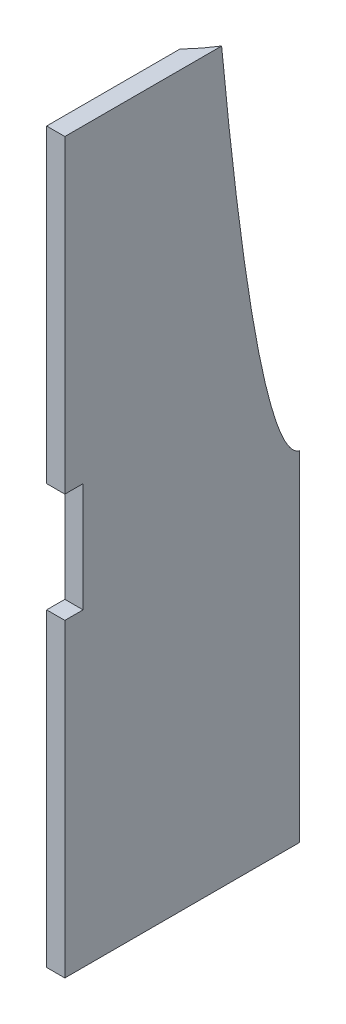
ISO-10303-21;
HEADER;
FILE_DESCRIPTION(('STEP AP214'),'2;1');
FILE_NAME('part.step','',(''),(''),'','','');
FILE_SCHEMA(('AUTOMOTIVE_DESIGN { 1 0 10303 214 1 1 1 1 }'));
ENDSEC;
DATA;
#1=APPLICATION_CONTEXT('core data for automotive mechanical design processes');
#2=APPLICATION_PROTOCOL_DEFINITION('international standard','automotive_design',2000,#1);
#3=PRODUCT_CONTEXT('',#1,'mechanical');
#4=PRODUCT('Part','Part','',(#3));
#5=PRODUCT_RELATED_PRODUCT_CATEGORY('part','',(#4));
#6=PRODUCT_DEFINITION_FORMATION('','',#4);
#7=PRODUCT_DEFINITION_CONTEXT('part definition',#1,'design');
#8=PRODUCT_DEFINITION('design','',#6,#7);
#9=PRODUCT_DEFINITION_SHAPE('','',#8);
#10=(LENGTH_UNIT() NAMED_UNIT(*) SI_UNIT(.MILLI.,.METRE.));
#11=(NAMED_UNIT(*) PLANE_ANGLE_UNIT() SI_UNIT($,.RADIAN.));
#12=(NAMED_UNIT(*) SI_UNIT($,.STERADIAN.) SOLID_ANGLE_UNIT());
#13=UNCERTAINTY_MEASURE_WITH_UNIT(LENGTH_MEASURE(1.E-05),#10,'distance_accuracy_value','');
#14=(GEOMETRIC_REPRESENTATION_CONTEXT(3) GLOBAL_UNCERTAINTY_ASSIGNED_CONTEXT((#13)) GLOBAL_UNIT_ASSIGNED_CONTEXT((#10,
#11,#12)) REPRESENTATION_CONTEXT('',''));
#15=CARTESIAN_POINT('',(0.,0.,0.));
#16=DIRECTION('',(0.,0.,1.));
#17=DIRECTION('',(1.,0.,0.));
#18=AXIS2_PLACEMENT_3D('',#15,#16,#17);
#19=CARTESIAN_POINT('',(0.,31.75,-7.73683999999999));
#20=DIRECTION('',(0.,0.,1.));
#21=DIRECTION('',(0.,-1.,0.));
#22=AXIS2_PLACEMENT_3D('',#19,#20,#21);
#23=PLANE('',#22);
#24=DIRECTION('',(-0.0593557164353479,-0.998236895193945,0.));
#25=VECTOR('',#24,1.);
#26=CARTESIAN_POINT('',(35.4305579406272,566.99568911841,-7.73683999999993));
#27=LINE('',#26,#25);
#28=CARTESIAN_POINT('',(1.58749999999875,-2.17255804310556,-7.73683999999997));
#29=VERTEX_POINT('',#28);
#30=CARTESIAN_POINT('',(0.,-28.8709312797254,-7.73683999999993));
#31=VERTEX_POINT('',#30);
#32=EDGE_CURVE('E12',#29,#31,#27,.T.);
#33=ORIENTED_EDGE('',*,*,#32,.F.);
#34=DIRECTION('',(0.,-1.,0.));
#35=VECTOR('',#34,1.);
#36=CARTESIAN_POINT('',(1.5875,31.75,-7.73683999999999));
#37=LINE('',#36,#35);
#38=CARTESIAN_POINT('',(1.5875,-31.75,-7.73684));
#39=VERTEX_POINT('',#38);
#40=EDGE_CURVE('E142',#29,#39,#37,.T.);
#41=ORIENTED_EDGE('',*,*,#40,.T.);
#42=DIRECTION('',(1.,0.,0.));
#43=VECTOR('',#42,1.);
#44=CARTESIAN_POINT('',(0.,-31.75,-7.73684));
#45=LINE('',#44,#43);
#46=CARTESIAN_POINT('',(0.,-31.75,-7.73684));
#47=VERTEX_POINT('',#46);
#48=EDGE_CURVE('E245',#47,#39,#45,.T.);
#49=ORIENTED_EDGE('',*,*,#48,.F.);
#50=DIRECTION('',(0.,-1.,0.));
#51=VECTOR('',#50,1.);
#52=CARTESIAN_POINT('',(0.,31.75,-7.73683999999999));
#53=LINE('',#52,#51);
#54=EDGE_CURVE('E215',#31,#47,#53,.T.);
#55=ORIENTED_EDGE('',*,*,#54,.F.);
#56=EDGE_LOOP('',(#33,#41,#49,#55));
#57=FACE_BOUND('',#56,.T.);
#58=ADVANCED_FACE('F138',(#57),#23,.F.);
#59=CARTESIAN_POINT('',(1.5875,-31.75,12.7));
#60=DIRECTION('',(0.,0.,-1.));
#61=DIRECTION('',(-1.,0.,0.));
#62=AXIS2_PLACEMENT_3D('',#59,#60,#61);
#63=PLANE('',#62);
#64=DIRECTION('',(1.,0.,0.));
#65=VECTOR('',#64,1.);
#66=CARTESIAN_POINT('',(-1.5875,4.7625,12.7));
#67=LINE('',#66,#65);
#68=CARTESIAN_POINT('',(0.,4.7625,12.7));
#69=VERTEX_POINT('',#68);
#70=CARTESIAN_POINT('',(1.5875,4.7625,12.7));
#71=VERTEX_POINT('',#70);
#72=EDGE_CURVE('E219',#69,#71,#67,.T.);
#73=ORIENTED_EDGE('',*,*,#72,.T.);
#74=DIRECTION('',(0.,-1.,0.));
#75=VECTOR('',#74,1.);
#76=CARTESIAN_POINT('',(1.5875,-31.75,12.7));
#77=LINE('',#76,#75);
#78=CARTESIAN_POINT('',(1.5875,31.75,12.7));
#79=VERTEX_POINT('',#78);
#80=EDGE_CURVE('E244',#79,#71,#77,.T.);
#81=ORIENTED_EDGE('',*,*,#80,.F.);
#82=DIRECTION('',(-1.,0.,0.));
#83=VECTOR('',#82,1.);
#84=CARTESIAN_POINT('',(1.5875,31.75,12.7));
#85=LINE('',#84,#83);
#86=CARTESIAN_POINT('',(0.,31.75,12.7));
#87=VERTEX_POINT('',#86);
#88=EDGE_CURVE('E221',#79,#87,#85,.T.);
#89=ORIENTED_EDGE('',*,*,#88,.T.);
#90=DIRECTION('',(0.,-1.,0.));
#91=VECTOR('',#90,1.);
#92=CARTESIAN_POINT('',(0.,-31.75,12.7));
#93=LINE('',#92,#91);
#94=EDGE_CURVE('E228',#87,#69,#93,.T.);
#95=ORIENTED_EDGE('',*,*,#94,.T.);
#96=EDGE_LOOP('',(#73,#81,#89,#95));
#97=FACE_BOUND('',#96,.T.);
#98=ADVANCED_FACE('F291',(#97),#63,.F.);
#99=CARTESIAN_POINT('',(1.5875,0.,0.));
#100=DIRECTION('',(-1.,0.,0.));
#101=DIRECTION('',(0.,0.,1.));
#102=AXIS2_PLACEMENT_3D('',#99,#100,#101);
#103=PLANE('',#102);
#104=CARTESIAN_POINT('',(1.5875,218.184665358992,-7.93749999999926));
#105=DIRECTION('',(-1.,0.,0.));
#106=DIRECTION('',(0.,-1.,0.));
#107=AXIS2_PLACEMENT_3D('',#104,#105,#106);
#108=ELLIPSE('',#107,220.383154068206,13.081);
#109=CARTESIAN_POINT('',(1.5875,31.75,-0.962041521268374));
#110=VERTEX_POINT('',#109);
#111=EDGE_CURVE('E148',#110,#29,#108,.F.);
#112=ORIENTED_EDGE('',*,*,#111,.F.);
#113=DIRECTION('',(0.,0.,1.));
#114=VECTOR('',#113,1.);
#115=CARTESIAN_POINT('',(1.5875,31.75,12.7));
#116=LINE('',#115,#114);
#117=EDGE_CURVE('E251',#110,#79,#116,.T.);
#118=ORIENTED_EDGE('',*,*,#117,.T.);
#119=ORIENTED_EDGE('',*,*,#80,.T.);
#120=DIRECTION('',(0.,0.,-1.));
#121=VECTOR('',#120,1.);
#122=CARTESIAN_POINT('',(1.5875,4.7625,12.7));
#123=LINE('',#122,#121);
#124=CARTESIAN_POINT('',(1.5875,4.7625,11.1125));
#125=VERTEX_POINT('',#124);
#126=EDGE_CURVE('E241',#71,#125,#123,.T.);
#127=ORIENTED_EDGE('',*,*,#126,.T.);
#128=DIRECTION('',(0.,-1.,0.));
#129=VECTOR('',#128,1.);
#130=CARTESIAN_POINT('',(1.5875,4.7625,11.1125));
#131=LINE('',#130,#129);
#132=CARTESIAN_POINT('',(1.5875,-4.7625,11.1125));
#133=VERTEX_POINT('',#132);
#134=EDGE_CURVE('E237',#125,#133,#131,.T.);
#135=ORIENTED_EDGE('',*,*,#134,.T.);
#136=DIRECTION('',(0.,0.,-1.));
#137=VECTOR('',#136,1.);
#138=CARTESIAN_POINT('',(1.5875,-4.7625,12.7));
#139=LINE('',#138,#137);
#140=CARTESIAN_POINT('',(1.5875,-4.7625,12.7));
#141=VERTEX_POINT('',#140);
#142=EDGE_CURVE('E234',#141,#133,#139,.T.);
#143=ORIENTED_EDGE('',*,*,#142,.F.);
#144=CARTESIAN_POINT('',(1.5875,-31.75,12.7));
#145=VERTEX_POINT('',#144);
#146=EDGE_CURVE('E240',#141,#145,#77,.T.);
#147=ORIENTED_EDGE('',*,*,#146,.T.);
#148=DIRECTION('',(0.,0.,-1.));
#149=VECTOR('',#148,1.);
#150=CARTESIAN_POINT('',(1.5875,-31.75,12.7));
#151=LINE('',#150,#149);
#152=EDGE_CURVE('E218',#145,#39,#151,.T.);
#153=ORIENTED_EDGE('',*,*,#152,.T.);
#154=ORIENTED_EDGE('',*,*,#40,.F.);
#155=EDGE_LOOP('',(#112,#118,#119,#127,#135,#143,#147,#153,#154));
#156=FACE_BOUND('',#155,.T.);
#157=ADVANCED_FACE('F140',(#156),#103,.F.);
#158=CARTESIAN_POINT('',(0.,0.,0.));
#159=DIRECTION('',(-1.,0.,0.));
#160=DIRECTION('',(0.,0.,1.));
#161=AXIS2_PLACEMENT_3D('',#158,#159,#160);
#162=PLANE('',#161);
#163=DIRECTION('',(0.,0.,1.));
#164=VECTOR('',#163,1.);
#165=CARTESIAN_POINT('',(0.,31.75,12.7));
#166=LINE('',#165,#164);
#167=CARTESIAN_POINT('',(0.,31.75,1.07461577579389));
#168=VERTEX_POINT('',#167);
#169=EDGE_CURVE('E253',#168,#87,#166,.T.);
#170=ORIENTED_EDGE('',*,*,#169,.F.);
#171=CARTESIAN_POINT('',(0.,191.48629212233,-7.93749999999926));
#172=DIRECTION('',(-1.,0.,0.));
#173=DIRECTION('',(0.,-1.,0.));
#174=AXIS2_PLACEMENT_3D('',#171,#172,#173);
#175=ELLIPSE('',#174,220.383154068206,13.081);
#176=EDGE_CURVE('E154',#168,#31,#175,.F.);
#177=ORIENTED_EDGE('',*,*,#176,.T.);
#178=ORIENTED_EDGE('',*,*,#54,.T.);
#179=DIRECTION('',(0.,0.,-1.));
#180=VECTOR('',#179,1.);
#181=CARTESIAN_POINT('',(0.,-31.75,12.7));
#182=LINE('',#181,#180);
#183=CARTESIAN_POINT('',(0.,-31.75,12.7));
#184=VERTEX_POINT('',#183);
#185=EDGE_CURVE('E248',#184,#47,#182,.T.);
#186=ORIENTED_EDGE('',*,*,#185,.F.);
#187=CARTESIAN_POINT('',(0.,-4.7625,12.7));
#188=VERTEX_POINT('',#187);
#189=EDGE_CURVE('E254',#188,#184,#93,.T.);
#190=ORIENTED_EDGE('',*,*,#189,.F.);
#191=DIRECTION('',(0.,0.,1.));
#192=VECTOR('',#191,1.);
#193=CARTESIAN_POINT('',(0.,-4.76249999999999,0.));
#194=LINE('',#193,#192);
#195=CARTESIAN_POINT('',(0.,-4.7625,11.1125));
#196=VERTEX_POINT('',#195);
#197=EDGE_CURVE('E266',#196,#188,#194,.T.);
#198=ORIENTED_EDGE('',*,*,#197,.F.);
#199=DIRECTION('',(0.,1.,0.));
#200=VECTOR('',#199,1.);
#201=CARTESIAN_POINT('',(0.,0.,11.1125));
#202=LINE('',#201,#200);
#203=CARTESIAN_POINT('',(0.,4.7625,11.1125));
#204=VERTEX_POINT('',#203);
#205=EDGE_CURVE('E256',#196,#204,#202,.T.);
#206=ORIENTED_EDGE('',*,*,#205,.T.);
#207=DIRECTION('',(0.,0.,1.));
#208=VECTOR('',#207,1.);
#209=CARTESIAN_POINT('',(0.,4.7625,0.));
#210=LINE('',#209,#208);
#211=EDGE_CURVE('E255',#204,#69,#210,.T.);
#212=ORIENTED_EDGE('',*,*,#211,.T.);
#213=ORIENTED_EDGE('',*,*,#94,.F.);
#214=EDGE_LOOP('',(#170,#177,#178,#186,#190,#198,#206,#212,#213));
#215=FACE_BOUND('',#214,.T.);
#216=ADVANCED_FACE('F290',(#215),#162,.T.);
#217=CARTESIAN_POINT('',(1.5875,31.75,12.7));
#218=DIRECTION('',(0.,-1.,0.));
#219=DIRECTION('',(0.,0.,-1.));
#220=AXIS2_PLACEMENT_3D('',#217,#218,#219);
#221=PLANE('',#220);
#222=CARTESIAN_POINT('',(-9.49800804327598,31.7500000000001,-7.93749999999926));
#223=DIRECTION('',(0.,-1.,0.));
#224=DIRECTION('',(-1.,0.,0.));
#225=AXIS2_PLACEMENT_3D('',#222,#223,#224);
#226=ELLIPSE('',#225,13.1041039085803,13.081);
#227=EDGE_CURVE('E206',#168,#110,#226,.F.);
#228=ORIENTED_EDGE('',*,*,#227,.F.);
#229=ORIENTED_EDGE('',*,*,#169,.T.);
#230=ORIENTED_EDGE('',*,*,#88,.F.);
#231=ORIENTED_EDGE('',*,*,#117,.F.);
#232=EDGE_LOOP('',(#228,#229,#230,#231));
#233=FACE_BOUND('',#232,.T.);
#234=ADVANCED_FACE('F294',(#233),#221,.F.);
#235=ORIENTED_EDGE('',*,*,#146,.F.);
#236=DIRECTION('',(1.,0.,0.));
#237=VECTOR('',#236,1.);
#238=CARTESIAN_POINT('',(-1.5875,-4.7625,12.7));
#239=LINE('',#238,#237);
#240=EDGE_CURVE('E232',#188,#141,#239,.T.);
#241=ORIENTED_EDGE('',*,*,#240,.F.);
#242=ORIENTED_EDGE('',*,*,#189,.T.);
#243=DIRECTION('',(-1.,0.,0.));
#244=VECTOR('',#243,1.);
#245=CARTESIAN_POINT('',(1.5875,-31.75,12.7));
#246=LINE('',#245,#244);
#247=EDGE_CURVE('E247',#145,#184,#246,.T.);
#248=ORIENTED_EDGE('',*,*,#247,.F.);
#249=EDGE_LOOP('',(#235,#241,#242,#248));
#250=FACE_BOUND('',#249,.T.);
#251=ADVANCED_FACE('F296',(#250),#63,.F.);
#252=CARTESIAN_POINT('',(1.5875,-31.75,12.7));
#253=DIRECTION('',(0.,1.,0.));
#254=DIRECTION('',(0.,0.,1.));
#255=AXIS2_PLACEMENT_3D('',#252,#253,#254);
#256=PLANE('',#255);
#257=ORIENTED_EDGE('',*,*,#185,.T.);
#258=ORIENTED_EDGE('',*,*,#48,.T.);
#259=ORIENTED_EDGE('',*,*,#152,.F.);
#260=ORIENTED_EDGE('',*,*,#247,.T.);
#261=EDGE_LOOP('',(#257,#258,#259,#260));
#262=FACE_BOUND('',#261,.T.);
#263=ADVANCED_FACE('F302',(#262),#256,.F.);
#264=CARTESIAN_POINT('',(-1.5875,4.7625,12.7));
#265=DIRECTION('',(0.,-1.,0.));
#266=DIRECTION('',(0.,0.,-1.));
#267=AXIS2_PLACEMENT_3D('',#264,#265,#266);
#268=PLANE('',#267);
#269=DIRECTION('',(1.,0.,0.));
#270=VECTOR('',#269,1.);
#271=CARTESIAN_POINT('',(-1.5875,4.7625,11.1125));
#272=LINE('',#271,#270);
#273=EDGE_CURVE('E271',#204,#125,#272,.T.);
#274=ORIENTED_EDGE('',*,*,#273,.T.);
#275=ORIENTED_EDGE('',*,*,#126,.F.);
#276=ORIENTED_EDGE('',*,*,#72,.F.);
#277=ORIENTED_EDGE('',*,*,#211,.F.);
#278=EDGE_LOOP('',(#274,#275,#276,#277));
#279=FACE_BOUND('',#278,.T.);
#280=ADVANCED_FACE('F287',(#279),#268,.T.);
#281=CARTESIAN_POINT('',(-1.5875,4.7625,11.1125));
#282=DIRECTION('',(0.,0.,1.));
#283=DIRECTION('',(1.,0.,0.));
#284=AXIS2_PLACEMENT_3D('',#281,#282,#283);
#285=PLANE('',#284);
#286=DIRECTION('',(1.,0.,0.));
#287=VECTOR('',#286,1.);
#288=CARTESIAN_POINT('',(-1.5875,-4.7625,11.1125));
#289=LINE('',#288,#287);
#290=EDGE_CURVE('E267',#196,#133,#289,.T.);
#291=ORIENTED_EDGE('',*,*,#290,.T.);
#292=ORIENTED_EDGE('',*,*,#134,.F.);
#293=ORIENTED_EDGE('',*,*,#273,.F.);
#294=ORIENTED_EDGE('',*,*,#205,.F.);
#295=EDGE_LOOP('',(#291,#292,#293,#294));
#296=FACE_BOUND('',#295,.T.);
#297=ADVANCED_FACE('F279',(#296),#285,.T.);
#298=CARTESIAN_POINT('',(-1.5875,-4.7625,12.7));
#299=DIRECTION('',(0.,-1.,0.));
#300=DIRECTION('',(0.,0.,-1.));
#301=AXIS2_PLACEMENT_3D('',#298,#299,#300);
#302=PLANE('',#301);
#303=ORIENTED_EDGE('',*,*,#197,.T.);
#304=ORIENTED_EDGE('',*,*,#240,.T.);
#305=ORIENTED_EDGE('',*,*,#142,.T.);
#306=ORIENTED_EDGE('',*,*,#290,.F.);
#307=EDGE_LOOP('',(#303,#304,#305,#306));
#308=FACE_BOUND('',#307,.T.);
#309=ADVANCED_FACE('F283',(#308),#302,.F.);
#310=CARTESIAN_POINT('',(22.3741575342089,567.772029888744,-7.93749999999926));
#311=DIRECTION('',(-0.0593557164353479,-0.998236895193945,0.));
#312=DIRECTION('',(0.,0.,-1.));
#313=AXIS2_PLACEMENT_3D('',#310,#311,#312);
#314=CYLINDRICAL_SURFACE('',#313,13.081);
#315=ORIENTED_EDGE('',*,*,#227,.T.);
#316=ORIENTED_EDGE('',*,*,#111,.T.);
#317=ORIENTED_EDGE('',*,*,#32,.T.);
#318=ORIENTED_EDGE('',*,*,#176,.F.);
#319=EDGE_LOOP('',(#315,#316,#317,#318));
#320=FACE_BOUND('',#319,.T.);
#321=ADVANCED_FACE('F205',(#320),#314,.F.);
#322=CLOSED_SHELL('',(#58,#98,#157,#216,#234,#251,#263,#280,#297,#309,#321));
#323=MANIFOLD_SOLID_BREP('B2',#322);
#324=ADVANCED_BREP_SHAPE_REPRESENTATION('',(#18,#323),#14);
#325=SHAPE_DEFINITION_REPRESENTATION(#9,#324);
ENDSEC;
END-ISO-10303-21;
